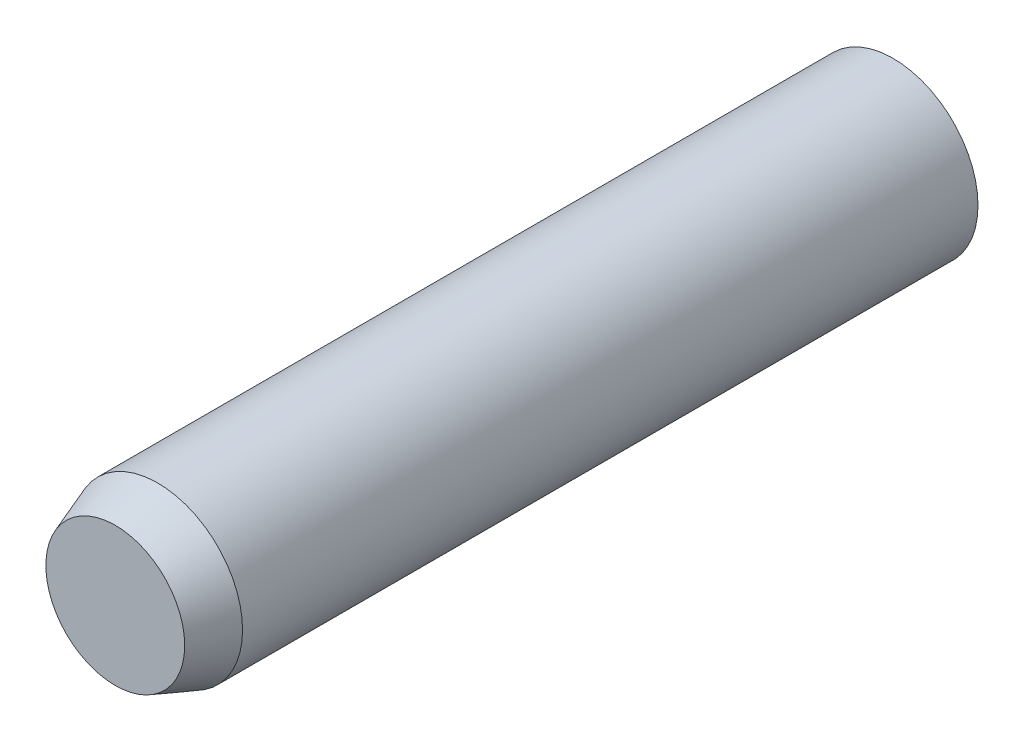
ISO-10303-21;
HEADER;
FILE_DESCRIPTION(('STEP AP214'),'2;1');
FILE_NAME('part.step','',(''),(''),'','','');
FILE_SCHEMA(('AUTOMOTIVE_DESIGN { 1 0 10303 214 1 1 1 1 }'));
ENDSEC;
DATA;
#1=APPLICATION_CONTEXT('core data for automotive mechanical design processes');
#2=APPLICATION_PROTOCOL_DEFINITION('international standard','automotive_design',2000,#1);
#3=PRODUCT_CONTEXT('',#1,'mechanical');
#4=PRODUCT('Part','Part','',(#3));
#5=PRODUCT_RELATED_PRODUCT_CATEGORY('part','',(#4));
#6=PRODUCT_DEFINITION_FORMATION('','',#4);
#7=PRODUCT_DEFINITION_CONTEXT('part definition',#1,'design');
#8=PRODUCT_DEFINITION('design','',#6,#7);
#9=PRODUCT_DEFINITION_SHAPE('','',#8);
#10=(LENGTH_UNIT() NAMED_UNIT(*) SI_UNIT(.MILLI.,.METRE.));
#11=(NAMED_UNIT(*) PLANE_ANGLE_UNIT() SI_UNIT($,.RADIAN.));
#12=(NAMED_UNIT(*) SI_UNIT($,.STERADIAN.) SOLID_ANGLE_UNIT());
#13=UNCERTAINTY_MEASURE_WITH_UNIT(LENGTH_MEASURE(1.E-05),#10,'distance_accuracy_value','');
#14=(GEOMETRIC_REPRESENTATION_CONTEXT(3) GLOBAL_UNCERTAINTY_ASSIGNED_CONTEXT((#13)) GLOBAL_UNIT_ASSIGNED_CONTEXT((#10,
#11,#12)) REPRESENTATION_CONTEXT('',''));
#15=CARTESIAN_POINT('',(0.,0.,0.));
#16=DIRECTION('',(0.,0.,1.));
#17=DIRECTION('',(1.,0.,0.));
#18=AXIS2_PLACEMENT_3D('',#15,#16,#17);
#19=CARTESIAN_POINT('',(0.,0.,55.));
#20=DIRECTION('',(0.,0.,-1.));
#21=DIRECTION('',(-1.,0.,0.));
#22=AXIS2_PLACEMENT_3D('',#19,#20,#21);
#23=CYLINDRICAL_SURFACE('',#22,6.);
#24=CARTESIAN_POINT('',(0.,0.,52.));
#25=DIRECTION('',(0.,0.,1.));
#26=DIRECTION('',(1.,0.,0.));
#27=AXIS2_PLACEMENT_3D('',#24,#25,#26);
#28=CIRCLE('',#27,6.);
#29=CARTESIAN_POINT('',(6.,0.,52.));
#30=VERTEX_POINT('',#29);
#31=EDGE_CURVE('E10',#30,#30,#28,.F.);
#32=ORIENTED_EDGE('',*,*,#31,.T.);
#33=EDGE_LOOP('',(#32));
#34=FACE_BOUND('',#33,.T.);
#35=CARTESIAN_POINT('',(0.,0.,0.));
#36=DIRECTION('',(0.,0.,1.));
#37=DIRECTION('',(1.,0.,0.));
#38=AXIS2_PLACEMENT_3D('',#35,#36,#37);
#39=CIRCLE('',#38,6.);
#40=CARTESIAN_POINT('',(6.,0.,0.));
#41=VERTEX_POINT('',#40);
#42=EDGE_CURVE('E52',#41,#41,#39,.T.);
#43=ORIENTED_EDGE('',*,*,#42,.T.);
#44=EDGE_LOOP('',(#43));
#45=FACE_BOUND('',#44,.T.);
#46=ADVANCED_FACE('F38',(#34,#45),#23,.T.);
#47=CARTESIAN_POINT('',(0.,0.,55.));
#48=DIRECTION('',(0.,0.,1.));
#49=DIRECTION('',(1.,0.,0.));
#50=AXIS2_PLACEMENT_3D('',#47,#48,#49);
#51=PLANE('',#50);
#52=CARTESIAN_POINT('',(0.,0.,55.));
#53=DIRECTION('',(0.,0.,1.));
#54=DIRECTION('',(1.,0.,0.));
#55=AXIS2_PLACEMENT_3D('',#52,#53,#54);
#56=CIRCLE('',#55,4.90808929720139);
#57=CARTESIAN_POINT('',(4.90808929720139,0.,55.));
#58=VERTEX_POINT('',#57);
#59=EDGE_CURVE('E47',#58,#58,#56,.T.);
#60=ORIENTED_EDGE('',*,*,#59,.T.);
#61=EDGE_LOOP('',(#60));
#62=FACE_BOUND('',#61,.T.);
#63=ADVANCED_FACE('F63',(#62),#51,.T.);
#64=CARTESIAN_POINT('',(0.,0.,0.));
#65=DIRECTION('',(0.,0.,1.));
#66=DIRECTION('',(1.,0.,0.));
#67=AXIS2_PLACEMENT_3D('',#64,#65,#66);
#68=PLANE('',#67);
#69=ORIENTED_EDGE('',*,*,#42,.F.);
#70=EDGE_LOOP('',(#69));
#71=FACE_BOUND('',#70,.T.);
#72=ADVANCED_FACE('F61',(#71),#68,.F.);
#73=CARTESIAN_POINT('',(0.,0.,55.));
#74=DIRECTION('',(0.,0.,-1.));
#75=DIRECTION('',(-1.,0.,0.));
#76=AXIS2_PLACEMENT_3D('',#73,#74,#75);
#77=CONICAL_SURFACE('',#76,4.90808929720139,0.349065850398864);
#78=ORIENTED_EDGE('',*,*,#31,.F.);
#79=EDGE_LOOP('',(#78));
#80=FACE_BOUND('',#79,.T.);
#81=ORIENTED_EDGE('',*,*,#59,.F.);
#82=EDGE_LOOP('',(#81));
#83=FACE_BOUND('',#82,.T.);
#84=ADVANCED_FACE('F41',(#80,#83),#77,.T.);
#85=CLOSED_SHELL('',(#46,#63,#72,#84));
#86=MANIFOLD_SOLID_BREP('B2',#85);
#87=ADVANCED_BREP_SHAPE_REPRESENTATION('',(#18,#86),#14);
#88=SHAPE_DEFINITION_REPRESENTATION(#9,#87);
ENDSEC;
END-ISO-10303-21;
